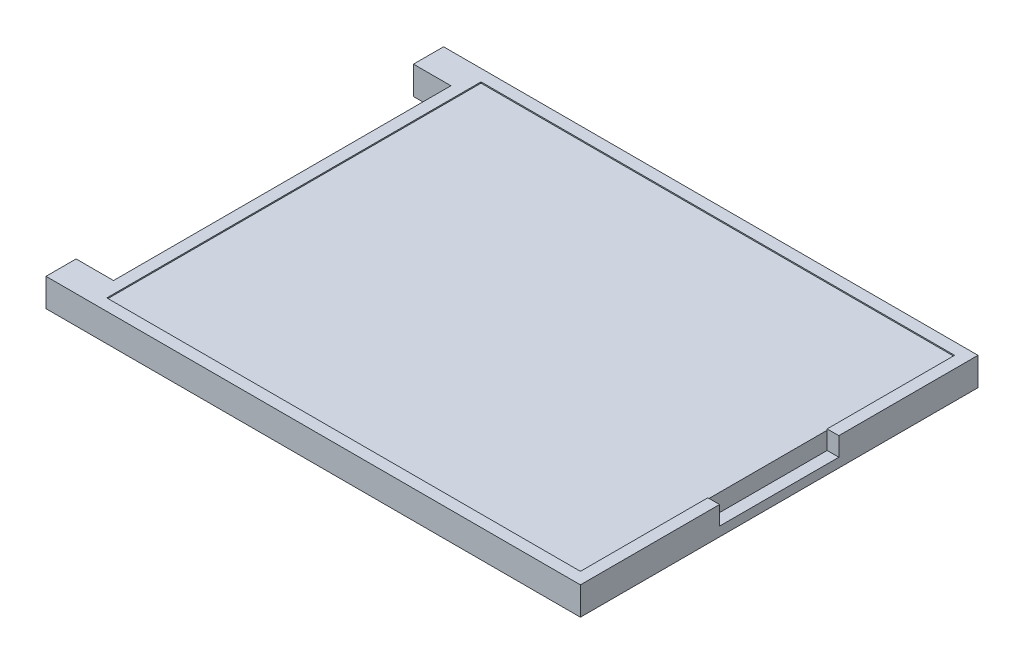
ISO-10303-21;
HEADER;
FILE_DESCRIPTION(('STEP AP214'),'2;1');
FILE_NAME('part.step','',(''),(''),'','','');
FILE_SCHEMA(('AUTOMOTIVE_DESIGN { 1 0 10303 214 1 1 1 1 }'));
ENDSEC;
DATA;
#1=APPLICATION_CONTEXT('core data for automotive mechanical design processes');
#2=APPLICATION_PROTOCOL_DEFINITION('international standard','automotive_design',2000,#1);
#3=PRODUCT_CONTEXT('',#1,'mechanical');
#4=PRODUCT('Part','Part','',(#3));
#5=PRODUCT_RELATED_PRODUCT_CATEGORY('part','',(#4));
#6=PRODUCT_DEFINITION_FORMATION('','',#4);
#7=PRODUCT_DEFINITION_CONTEXT('part definition',#1,'design');
#8=PRODUCT_DEFINITION('design','',#6,#7);
#9=PRODUCT_DEFINITION_SHAPE('','',#8);
#10=(LENGTH_UNIT() NAMED_UNIT(*) SI_UNIT(.MILLI.,.METRE.));
#11=(NAMED_UNIT(*) PLANE_ANGLE_UNIT() SI_UNIT($,.RADIAN.));
#12=(NAMED_UNIT(*) SI_UNIT($,.STERADIAN.) SOLID_ANGLE_UNIT());
#13=UNCERTAINTY_MEASURE_WITH_UNIT(LENGTH_MEASURE(1.E-05),#10,'distance_accuracy_value','');
#14=(GEOMETRIC_REPRESENTATION_CONTEXT(3) GLOBAL_UNCERTAINTY_ASSIGNED_CONTEXT((#13)) GLOBAL_UNIT_ASSIGNED_CONTEXT((#10,
#11,#12)) REPRESENTATION_CONTEXT('',''));
#15=CARTESIAN_POINT('',(0.,0.,0.));
#16=DIRECTION('',(0.,0.,1.));
#17=DIRECTION('',(1.,0.,0.));
#18=AXIS2_PLACEMENT_3D('',#15,#16,#17);
#19=CARTESIAN_POINT('',(0.,4.,0.));
#20=DIRECTION('',(0.,1.,0.));
#21=DIRECTION('',(0.,0.,1.));
#22=AXIS2_PLACEMENT_3D('',#19,#20,#21);
#23=PLANE('',#22);
#24=DIRECTION('',(0.,0.,-1.));
#25=VECTOR('',#24,1.);
#26=CARTESIAN_POINT('',(23.8,4.,-16.));
#27=LINE('',#26,#25);
#28=CARTESIAN_POINT('',(23.8,4.,-5.1));
#29=VERTEX_POINT('',#28);
#30=CARTESIAN_POINT('',(23.8,4.,-16.));
#31=VERTEX_POINT('',#30);
#32=EDGE_CURVE('E170',#29,#31,#27,.T.);
#33=ORIENTED_EDGE('',*,*,#32,.T.);
#34=DIRECTION('',(-1.,0.,0.));
#35=VECTOR('',#34,1.);
#36=CARTESIAN_POINT('',(-16.7,4.,-16.));
#37=LINE('',#36,#35);
#38=CARTESIAN_POINT('',(-16.7,4.,-16.));
#39=VERTEX_POINT('',#38);
#40=EDGE_CURVE('E162',#31,#39,#37,.T.);
#41=ORIENTED_EDGE('',*,*,#40,.T.);
#42=DIRECTION('',(0.,0.,1.));
#43=VECTOR('',#42,1.);
#44=CARTESIAN_POINT('',(-16.7,4.,-16.));
#45=LINE('',#44,#43);
#46=CARTESIAN_POINT('',(-16.7,4.,16.));
#47=VERTEX_POINT('',#46);
#48=EDGE_CURVE('E152',#39,#47,#45,.T.);
#49=ORIENTED_EDGE('',*,*,#48,.T.);
#50=DIRECTION('',(1.,0.,0.));
#51=VECTOR('',#50,1.);
#52=CARTESIAN_POINT('',(-16.7,4.,16.));
#53=LINE('',#52,#51);
#54=CARTESIAN_POINT('',(23.8,4.,16.));
#55=VERTEX_POINT('',#54);
#56=EDGE_CURVE('E134',#47,#55,#53,.T.);
#57=ORIENTED_EDGE('',*,*,#56,.T.);
#58=DIRECTION('',(0.,0.,-1.));
#59=VECTOR('',#58,1.);
#60=CARTESIAN_POINT('',(23.8,4.,-16.));
#61=LINE('',#60,#59);
#62=CARTESIAN_POINT('',(23.8,4.,5.1));
#63=VERTEX_POINT('',#62);
#64=EDGE_CURVE('E141',#55,#63,#61,.T.);
#65=ORIENTED_EDGE('',*,*,#64,.T.);
#66=DIRECTION('',(0.,0.,1.));
#67=VECTOR('',#66,1.);
#68=CARTESIAN_POINT('',(23.8,4.,-5.1));
#69=LINE('',#68,#67);
#70=EDGE_CURVE('E20',#63,#29,#69,.F.);
#71=ORIENTED_EDGE('',*,*,#70,.T.);
#72=EDGE_LOOP('',(#33,#41,#49,#57,#65,#71));
#73=FACE_BOUND('',#72,.T.);
#74=ADVANCED_FACE('F17',(#73),#23,.T.);
#75=CARTESIAN_POINT('',(23.8,2.5,-5.1));
#76=DIRECTION('',(-1.,0.,0.));
#77=DIRECTION('',(0.,0.,1.));
#78=AXIS2_PLACEMENT_3D('',#75,#76,#77);
#79=PLANE('',#78);
#80=DIRECTION('',(0.,1.,0.));
#81=VECTOR('',#80,1.);
#82=CARTESIAN_POINT('',(23.8,2.5,5.1));
#83=LINE('',#82,#81);
#84=CARTESIAN_POINT('',(23.8,2.5,5.1));
#85=VERTEX_POINT('',#84);
#86=EDGE_CURVE('E179',#63,#85,#83,.F.);
#87=ORIENTED_EDGE('',*,*,#86,.T.);
#88=DIRECTION('',(0.,0.,-1.));
#89=VECTOR('',#88,1.);
#90=CARTESIAN_POINT('',(23.8,2.5,0.));
#91=LINE('',#90,#89);
#92=CARTESIAN_POINT('',(23.8,2.5,-5.1));
#93=VERTEX_POINT('',#92);
#94=EDGE_CURVE('E184',#85,#93,#91,.T.);
#95=ORIENTED_EDGE('',*,*,#94,.T.);
#96=DIRECTION('',(0.,1.,0.));
#97=VECTOR('',#96,1.);
#98=CARTESIAN_POINT('',(23.8,2.5,-5.1));
#99=LINE('',#98,#97);
#100=EDGE_CURVE('E172',#93,#29,#99,.T.);
#101=ORIENTED_EDGE('',*,*,#100,.T.);
#102=ORIENTED_EDGE('',*,*,#70,.F.);
#103=EDGE_LOOP('',(#87,#95,#101,#102));
#104=FACE_BOUND('',#103,.T.);
#105=ADVANCED_FACE('F359',(#104),#79,.F.);
#106=CARTESIAN_POINT('',(23.8,4.,-16.));
#107=DIRECTION('',(1.,0.,0.));
#108=DIRECTION('',(0.,0.,-1.));
#109=AXIS2_PLACEMENT_3D('',#106,#107,#108);
#110=PLANE('',#109);
#111=DIRECTION('',(0.,1.,0.));
#112=VECTOR('',#111,1.);
#113=CARTESIAN_POINT('',(23.8,2.5,5.1));
#114=LINE('',#113,#112);
#115=CARTESIAN_POINT('',(23.8,4.1,5.1));
#116=VERTEX_POINT('',#115);
#117=EDGE_CURVE('E146',#116,#63,#114,.F.);
#118=ORIENTED_EDGE('',*,*,#117,.T.);
#119=ORIENTED_EDGE('',*,*,#64,.F.);
#120=DIRECTION('',(0.,1.,0.));
#121=VECTOR('',#120,1.);
#122=CARTESIAN_POINT('',(23.8,4.,16.));
#123=LINE('',#122,#121);
#124=CARTESIAN_POINT('',(23.8,4.1,16.));
#125=VERTEX_POINT('',#124);
#126=EDGE_CURVE('E144',#55,#125,#123,.T.);
#127=ORIENTED_EDGE('',*,*,#126,.T.);
#128=DIRECTION('',(0.,0.,1.));
#129=VECTOR('',#128,1.);
#130=CARTESIAN_POINT('',(23.8,4.1,0.));
#131=LINE('',#130,#129);
#132=EDGE_CURVE('E193',#116,#125,#131,.T.);
#133=ORIENTED_EDGE('',*,*,#132,.F.);
#134=EDGE_LOOP('',(#118,#119,#127,#133));
#135=FACE_BOUND('',#134,.T.);
#136=ADVANCED_FACE('F142',(#135),#110,.F.);
#137=CARTESIAN_POINT('',(-16.7,4.,16.));
#138=DIRECTION('',(0.,0.,1.));
#139=DIRECTION('',(1.,0.,0.));
#140=AXIS2_PLACEMENT_3D('',#137,#138,#139);
#141=PLANE('',#140);
#142=ORIENTED_EDGE('',*,*,#126,.F.);
#143=ORIENTED_EDGE('',*,*,#56,.F.);
#144=DIRECTION('',(0.,1.,0.));
#145=VECTOR('',#144,1.);
#146=CARTESIAN_POINT('',(-16.7,4.,16.));
#147=LINE('',#146,#145);
#148=CARTESIAN_POINT('',(-16.7,4.1,16.));
#149=VERTEX_POINT('',#148);
#150=EDGE_CURVE('E160',#47,#149,#147,.T.);
#151=ORIENTED_EDGE('',*,*,#150,.T.);
#152=DIRECTION('',(1.,0.,0.));
#153=VECTOR('',#152,1.);
#154=CARTESIAN_POINT('',(0.,4.1,16.));
#155=LINE('',#154,#153);
#156=EDGE_CURVE('E151',#125,#149,#155,.F.);
#157=ORIENTED_EDGE('',*,*,#156,.F.);
#158=EDGE_LOOP('',(#142,#143,#151,#157));
#159=FACE_BOUND('',#158,.T.);
#160=ADVANCED_FACE('F150',(#159),#141,.F.);
#161=CARTESIAN_POINT('',(-16.7,4.,-16.));
#162=DIRECTION('',(-1.,0.,0.));
#163=DIRECTION('',(0.,0.,1.));
#164=AXIS2_PLACEMENT_3D('',#161,#162,#163);
#165=PLANE('',#164);
#166=ORIENTED_EDGE('',*,*,#150,.F.);
#167=ORIENTED_EDGE('',*,*,#48,.F.);
#168=DIRECTION('',(0.,1.,0.));
#169=VECTOR('',#168,1.);
#170=CARTESIAN_POINT('',(-16.7,4.,-16.));
#171=LINE('',#170,#169);
#172=CARTESIAN_POINT('',(-16.7,4.1,-16.));
#173=VERTEX_POINT('',#172);
#174=EDGE_CURVE('E164',#39,#173,#171,.T.);
#175=ORIENTED_EDGE('',*,*,#174,.T.);
#176=DIRECTION('',(0.,0.,1.));
#177=VECTOR('',#176,1.);
#178=CARTESIAN_POINT('',(-16.7,4.1,0.));
#179=LINE('',#178,#177);
#180=EDGE_CURVE('E196',#149,#173,#179,.F.);
#181=ORIENTED_EDGE('',*,*,#180,.F.);
#182=EDGE_LOOP('',(#166,#167,#175,#181));
#183=FACE_BOUND('',#182,.T.);
#184=ADVANCED_FACE('F351',(#183),#165,.F.);
#185=CARTESIAN_POINT('',(-16.7,4.,-16.));
#186=DIRECTION('',(0.,0.,-1.));
#187=DIRECTION('',(-1.,0.,0.));
#188=AXIS2_PLACEMENT_3D('',#185,#186,#187);
#189=PLANE('',#188);
#190=ORIENTED_EDGE('',*,*,#174,.F.);
#191=ORIENTED_EDGE('',*,*,#40,.F.);
#192=DIRECTION('',(0.,1.,0.));
#193=VECTOR('',#192,1.);
#194=CARTESIAN_POINT('',(23.8,4.,-16.));
#195=LINE('',#194,#193);
#196=CARTESIAN_POINT('',(23.8,4.1,-16.));
#197=VERTEX_POINT('',#196);
#198=EDGE_CURVE('E167',#31,#197,#195,.T.);
#199=ORIENTED_EDGE('',*,*,#198,.T.);
#200=DIRECTION('',(1.,0.,0.));
#201=VECTOR('',#200,1.);
#202=CARTESIAN_POINT('',(0.,4.1,-16.));
#203=LINE('',#202,#201);
#204=EDGE_CURVE('E198',#173,#197,#203,.T.);
#205=ORIENTED_EDGE('',*,*,#204,.F.);
#206=EDGE_LOOP('',(#190,#191,#199,#205));
#207=FACE_BOUND('',#206,.T.);
#208=ADVANCED_FACE('F347',(#207),#189,.F.);
#209=CARTESIAN_POINT('',(23.8,4.,-16.));
#210=DIRECTION('',(1.,0.,0.));
#211=DIRECTION('',(0.,0.,-1.));
#212=AXIS2_PLACEMENT_3D('',#209,#210,#211);
#213=PLANE('',#212);
#214=DIRECTION('',(0.,1.,0.));
#215=VECTOR('',#214,1.);
#216=CARTESIAN_POINT('',(23.8,2.5,-5.1));
#217=LINE('',#216,#215);
#218=CARTESIAN_POINT('',(23.8,4.1,-5.1));
#219=VERTEX_POINT('',#218);
#220=EDGE_CURVE('E175',#29,#219,#217,.T.);
#221=ORIENTED_EDGE('',*,*,#220,.T.);
#222=DIRECTION('',(0.,0.,1.));
#223=VECTOR('',#222,1.);
#224=CARTESIAN_POINT('',(23.8,4.1,0.));
#225=LINE('',#224,#223);
#226=EDGE_CURVE('E200',#197,#219,#225,.T.);
#227=ORIENTED_EDGE('',*,*,#226,.F.);
#228=ORIENTED_EDGE('',*,*,#198,.F.);
#229=ORIENTED_EDGE('',*,*,#32,.F.);
#230=EDGE_LOOP('',(#221,#227,#228,#229));
#231=FACE_BOUND('',#230,.T.);
#232=ADVANCED_FACE('F343',(#231),#213,.F.);
#233=CARTESIAN_POINT('',(24.8,2.5,-5.1));
#234=DIRECTION('',(0.,0.,-1.));
#235=DIRECTION('',(-1.,0.,0.));
#236=AXIS2_PLACEMENT_3D('',#233,#234,#235);
#237=PLANE('',#236);
#238=ORIENTED_EDGE('',*,*,#220,.F.);
#239=ORIENTED_EDGE('',*,*,#100,.F.);
#240=DIRECTION('',(1.,0.,0.));
#241=VECTOR('',#240,1.);
#242=CARTESIAN_POINT('',(0.,2.5,-5.1));
#243=LINE('',#242,#241);
#244=CARTESIAN_POINT('',(24.8,2.5,-5.1));
#245=VERTEX_POINT('',#244);
#246=EDGE_CURVE('E187',#93,#245,#243,.T.);
#247=ORIENTED_EDGE('',*,*,#246,.T.);
#248=DIRECTION('',(0.,1.,0.));
#249=VECTOR('',#248,1.);
#250=CARTESIAN_POINT('',(24.8,4.1,-5.1));
#251=LINE('',#250,#249);
#252=CARTESIAN_POINT('',(24.8,4.1,-5.1));
#253=VERTEX_POINT('',#252);
#254=EDGE_CURVE('E221',#245,#253,#251,.T.);
#255=ORIENTED_EDGE('',*,*,#254,.T.);
#256=DIRECTION('',(1.,0.,0.));
#257=VECTOR('',#256,1.);
#258=CARTESIAN_POINT('',(0.,4.1,-5.1));
#259=LINE('',#258,#257);
#260=EDGE_CURVE('E202',#219,#253,#259,.T.);
#261=ORIENTED_EDGE('',*,*,#260,.F.);
#262=EDGE_LOOP('',(#238,#239,#247,#255,#261));
#263=FACE_BOUND('',#262,.T.);
#264=ADVANCED_FACE('F339',(#263),#237,.F.);
#265=CARTESIAN_POINT('',(24.8,2.5,5.1));
#266=DIRECTION('',(0.,0.,1.));
#267=DIRECTION('',(1.,0.,0.));
#268=AXIS2_PLACEMENT_3D('',#265,#266,#267);
#269=PLANE('',#268);
#270=DIRECTION('',(0.,1.,0.));
#271=VECTOR('',#270,1.);
#272=CARTESIAN_POINT('',(24.8,4.1,5.1));
#273=LINE('',#272,#271);
#274=CARTESIAN_POINT('',(24.8,4.1,5.1));
#275=VERTEX_POINT('',#274);
#276=CARTESIAN_POINT('',(24.8,2.5,5.1));
#277=VERTEX_POINT('',#276);
#278=EDGE_CURVE('E232',#275,#277,#273,.F.);
#279=ORIENTED_EDGE('',*,*,#278,.T.);
#280=DIRECTION('',(1.,0.,0.));
#281=VECTOR('',#280,1.);
#282=CARTESIAN_POINT('',(0.,2.5,5.1));
#283=LINE('',#282,#281);
#284=EDGE_CURVE('E181',#277,#85,#283,.F.);
#285=ORIENTED_EDGE('',*,*,#284,.T.);
#286=ORIENTED_EDGE('',*,*,#86,.F.);
#287=ORIENTED_EDGE('',*,*,#117,.F.);
#288=DIRECTION('',(1.,0.,0.));
#289=VECTOR('',#288,1.);
#290=CARTESIAN_POINT('',(0.,4.1,5.1));
#291=LINE('',#290,#289);
#292=EDGE_CURVE('E190',#275,#116,#291,.F.);
#293=ORIENTED_EDGE('',*,*,#292,.F.);
#294=EDGE_LOOP('',(#279,#285,#286,#287,#293));
#295=FACE_BOUND('',#294,.T.);
#296=ADVANCED_FACE('F335',(#295),#269,.F.);
#297=CARTESIAN_POINT('',(0.,2.5,0.));
#298=DIRECTION('',(0.,-1.,0.));
#299=DIRECTION('',(0.,0.,-1.));
#300=AXIS2_PLACEMENT_3D('',#297,#298,#299);
#301=PLANE('',#300);
#302=ORIENTED_EDGE('',*,*,#246,.F.);
#303=ORIENTED_EDGE('',*,*,#94,.F.);
#304=ORIENTED_EDGE('',*,*,#284,.F.);
#305=DIRECTION('',(0.,0.,1.));
#306=VECTOR('',#305,1.);
#307=CARTESIAN_POINT('',(24.8,2.5,0.));
#308=LINE('',#307,#306);
#309=EDGE_CURVE('E235',#277,#245,#308,.F.);
#310=ORIENTED_EDGE('',*,*,#309,.T.);
#311=EDGE_LOOP('',(#302,#303,#304,#310));
#312=FACE_BOUND('',#311,.T.);
#313=ADVANCED_FACE('F331',(#312),#301,.F.);
#314=CARTESIAN_POINT('',(0.,4.1,0.));
#315=DIRECTION('',(0.,1.,0.));
#316=DIRECTION('',(0.,0.,1.));
#317=AXIS2_PLACEMENT_3D('',#314,#315,#316);
#318=PLANE('',#317);
#319=DIRECTION('',(-1.,0.,0.));
#320=VECTOR('',#319,1.);
#321=CARTESIAN_POINT('',(0.,4.1,17.));
#322=LINE('',#321,#320);
#323=CARTESIAN_POINT('',(-20.9,4.1,17.));
#324=VERTEX_POINT('',#323);
#325=CARTESIAN_POINT('',(24.8,4.1,17.));
#326=VERTEX_POINT('',#325);
#327=EDGE_CURVE('E219',#324,#326,#322,.F.);
#328=ORIENTED_EDGE('',*,*,#327,.T.);
#329=DIRECTION('',(0.,0.,1.));
#330=VECTOR('',#329,1.);
#331=CARTESIAN_POINT('',(24.8,4.1,0.));
#332=LINE('',#331,#330);
#333=EDGE_CURVE('E229',#326,#275,#332,.F.);
#334=ORIENTED_EDGE('',*,*,#333,.T.);
#335=ORIENTED_EDGE('',*,*,#292,.T.);
#336=ORIENTED_EDGE('',*,*,#132,.T.);
#337=ORIENTED_EDGE('',*,*,#156,.T.);
#338=ORIENTED_EDGE('',*,*,#180,.T.);
#339=ORIENTED_EDGE('',*,*,#204,.T.);
#340=ORIENTED_EDGE('',*,*,#226,.T.);
#341=ORIENTED_EDGE('',*,*,#260,.T.);
#342=DIRECTION('',(0.,0.,1.));
#343=VECTOR('',#342,1.);
#344=CARTESIAN_POINT('',(24.8,4.1,0.));
#345=LINE('',#344,#343);
#346=CARTESIAN_POINT('',(24.8,4.1,-17.));
#347=VERTEX_POINT('',#346);
#348=EDGE_CURVE('E224',#253,#347,#345,.F.);
#349=ORIENTED_EDGE('',*,*,#348,.T.);
#350=DIRECTION('',(1.,0.,0.));
#351=VECTOR('',#350,1.);
#352=CARTESIAN_POINT('',(0.,4.1,-17.));
#353=LINE('',#352,#351);
#354=CARTESIAN_POINT('',(-20.9,4.1,-17.));
#355=VERTEX_POINT('',#354);
#356=EDGE_CURVE('E241',#347,#355,#353,.F.);
#357=ORIENTED_EDGE('',*,*,#356,.T.);
#358=DIRECTION('',(0.,0.,-1.));
#359=VECTOR('',#358,1.);
#360=CARTESIAN_POINT('',(-20.9,4.1,0.));
#361=LINE('',#360,#359);
#362=CARTESIAN_POINT('',(-20.9,4.1,-14.425));
#363=VERTEX_POINT('',#362);
#364=EDGE_CURVE('E246',#355,#363,#361,.F.);
#365=ORIENTED_EDGE('',*,*,#364,.T.);
#366=DIRECTION('',(-1.,0.,0.));
#367=VECTOR('',#366,1.);
#368=CARTESIAN_POINT('',(0.,4.1,-14.425));
#369=LINE('',#368,#367);
#370=CARTESIAN_POINT('',(-17.7,4.1,-14.425));
#371=VERTEX_POINT('',#370);
#372=EDGE_CURVE('E249',#363,#371,#369,.F.);
#373=ORIENTED_EDGE('',*,*,#372,.T.);
#374=DIRECTION('',(0.,0.,-1.));
#375=VECTOR('',#374,1.);
#376=CARTESIAN_POINT('',(-17.7,4.1,0.));
#377=LINE('',#376,#375);
#378=CARTESIAN_POINT('',(-17.7,4.1,14.425));
#379=VERTEX_POINT('',#378);
#380=EDGE_CURVE('E204',#371,#379,#377,.F.);
#381=ORIENTED_EDGE('',*,*,#380,.T.);
#382=DIRECTION('',(-1.,0.,0.));
#383=VECTOR('',#382,1.);
#384=CARTESIAN_POINT('',(0.,4.1,14.425));
#385=LINE('',#384,#383);
#386=CARTESIAN_POINT('',(-20.9,4.1,14.425));
#387=VERTEX_POINT('',#386);
#388=EDGE_CURVE('E207',#387,#379,#385,.F.);
#389=ORIENTED_EDGE('',*,*,#388,.F.);
#390=DIRECTION('',(0.,0.,-1.));
#391=VECTOR('',#390,1.);
#392=CARTESIAN_POINT('',(-20.9,4.1,0.));
#393=LINE('',#392,#391);
#394=EDGE_CURVE('E214',#387,#324,#393,.F.);
#395=ORIENTED_EDGE('',*,*,#394,.T.);
#396=EDGE_LOOP('',(#328,#334,#335,#336,#337,#338,#339,#340,#341,#349,#357,#365,#373,#381,#389,#395));
#397=FACE_BOUND('',#396,.T.);
#398=ADVANCED_FACE('F328',(#397),#318,.T.);
#399=CARTESIAN_POINT('',(-17.7,4.1,0.));
#400=DIRECTION('',(1.,0.,0.));
#401=DIRECTION('',(0.,0.,-1.));
#402=AXIS2_PLACEMENT_3D('',#399,#400,#401);
#403=PLANE('',#402);
#404=DIRECTION('',(0.,1.,0.));
#405=VECTOR('',#404,1.);
#406=CARTESIAN_POINT('',(-17.7,4.1,14.425));
#407=LINE('',#406,#405);
#408=CARTESIAN_POINT('',(-17.7,1.7,14.425));
#409=VERTEX_POINT('',#408);
#410=EDGE_CURVE('E209',#379,#409,#407,.F.);
#411=ORIENTED_EDGE('',*,*,#410,.F.);
#412=ORIENTED_EDGE('',*,*,#380,.F.);
#413=DIRECTION('',(0.,1.,0.));
#414=VECTOR('',#413,1.);
#415=CARTESIAN_POINT('',(-17.7,4.1,-14.425));
#416=LINE('',#415,#414);
#417=CARTESIAN_POINT('',(-17.7,1.7,-14.425));
#418=VERTEX_POINT('',#417);
#419=EDGE_CURVE('E252',#371,#418,#416,.F.);
#420=ORIENTED_EDGE('',*,*,#419,.T.);
#421=DIRECTION('',(0.,0.,1.));
#422=VECTOR('',#421,1.);
#423=CARTESIAN_POINT('',(-17.7,1.7,0.));
#424=LINE('',#423,#422);
#425=EDGE_CURVE('E255',#418,#409,#424,.T.);
#426=ORIENTED_EDGE('',*,*,#425,.T.);
#427=EDGE_LOOP('',(#411,#412,#420,#426));
#428=FACE_BOUND('',#427,.T.);
#429=ADVANCED_FACE('F303',(#428),#403,.F.);
#430=CARTESIAN_POINT('',(0.,4.1,14.425));
#431=DIRECTION('',(0.,0.,-1.));
#432=DIRECTION('',(-1.,0.,0.));
#433=AXIS2_PLACEMENT_3D('',#430,#431,#432);
#434=PLANE('',#433);
#435=ORIENTED_EDGE('',*,*,#388,.T.);
#436=ORIENTED_EDGE('',*,*,#410,.T.);
#437=DIRECTION('',(1.,0.,0.));
#438=VECTOR('',#437,1.);
#439=CARTESIAN_POINT('',(0.,1.7,14.425));
#440=LINE('',#439,#438);
#441=CARTESIAN_POINT('',(-20.9,1.7,14.425));
#442=VERTEX_POINT('',#441);
#443=EDGE_CURVE('E258',#409,#442,#440,.F.);
#444=ORIENTED_EDGE('',*,*,#443,.T.);
#445=DIRECTION('',(0.,1.,0.));
#446=VECTOR('',#445,1.);
#447=CARTESIAN_POINT('',(-20.9,4.1,14.425));
#448=LINE('',#447,#446);
#449=EDGE_CURVE('E211',#442,#387,#448,.T.);
#450=ORIENTED_EDGE('',*,*,#449,.T.);
#451=EDGE_LOOP('',(#435,#436,#444,#450));
#452=FACE_BOUND('',#451,.T.);
#453=ADVANCED_FACE('F300',(#452),#434,.T.);
#454=CARTESIAN_POINT('',(-20.9,4.1,0.));
#455=DIRECTION('',(1.,0.,0.));
#456=DIRECTION('',(0.,0.,-1.));
#457=AXIS2_PLACEMENT_3D('',#454,#455,#456);
#458=PLANE('',#457);
#459=DIRECTION('',(0.,1.,0.));
#460=VECTOR('',#459,1.);
#461=CARTESIAN_POINT('',(-20.9,4.1,17.));
#462=LINE('',#461,#460);
#463=CARTESIAN_POINT('',(-20.9,1.7,17.));
#464=VERTEX_POINT('',#463);
#465=EDGE_CURVE('E216',#464,#324,#462,.T.);
#466=ORIENTED_EDGE('',*,*,#465,.T.);
#467=ORIENTED_EDGE('',*,*,#394,.F.);
#468=ORIENTED_EDGE('',*,*,#449,.F.);
#469=DIRECTION('',(0.,0.,1.));
#470=VECTOR('',#469,1.);
#471=CARTESIAN_POINT('',(-20.9,1.7,0.));
#472=LINE('',#471,#470);
#473=EDGE_CURVE('E261',#442,#464,#472,.T.);
#474=ORIENTED_EDGE('',*,*,#473,.T.);
#475=EDGE_LOOP('',(#466,#467,#468,#474));
#476=FACE_BOUND('',#475,.T.);
#477=ADVANCED_FACE('F297',(#476),#458,.F.);
#478=CARTESIAN_POINT('',(0.,4.1,17.));
#479=DIRECTION('',(0.,0.,-1.));
#480=DIRECTION('',(-1.,0.,0.));
#481=AXIS2_PLACEMENT_3D('',#478,#479,#480);
#482=PLANE('',#481);
#483=DIRECTION('',(0.,1.,0.));
#484=VECTOR('',#483,1.);
#485=CARTESIAN_POINT('',(24.8,4.1,17.));
#486=LINE('',#485,#484);
#487=CARTESIAN_POINT('',(24.8,1.7,17.));
#488=VERTEX_POINT('',#487);
#489=EDGE_CURVE('E226',#488,#326,#486,.T.);
#490=ORIENTED_EDGE('',*,*,#489,.T.);
#491=ORIENTED_EDGE('',*,*,#327,.F.);
#492=ORIENTED_EDGE('',*,*,#465,.F.);
#493=DIRECTION('',(1.,0.,0.));
#494=VECTOR('',#493,1.);
#495=CARTESIAN_POINT('',(0.,1.7,17.));
#496=LINE('',#495,#494);
#497=EDGE_CURVE('E264',#464,#488,#496,.T.);
#498=ORIENTED_EDGE('',*,*,#497,.T.);
#499=EDGE_LOOP('',(#490,#491,#492,#498));
#500=FACE_BOUND('',#499,.T.);
#501=ADVANCED_FACE('F293',(#500),#482,.F.);
#502=CARTESIAN_POINT('',(24.8,4.1,0.));
#503=DIRECTION('',(-1.,0.,0.));
#504=DIRECTION('',(0.,0.,1.));
#505=AXIS2_PLACEMENT_3D('',#502,#503,#504);
#506=PLANE('',#505);
#507=ORIENTED_EDGE('',*,*,#278,.F.);
#508=ORIENTED_EDGE('',*,*,#333,.F.);
#509=ORIENTED_EDGE('',*,*,#489,.F.);
#510=DIRECTION('',(0.,0.,1.));
#511=VECTOR('',#510,1.);
#512=CARTESIAN_POINT('',(24.8,1.7,0.));
#513=LINE('',#512,#511);
#514=CARTESIAN_POINT('',(24.8,1.7,-17.));
#515=VERTEX_POINT('',#514);
#516=EDGE_CURVE('E267',#488,#515,#513,.F.);
#517=ORIENTED_EDGE('',*,*,#516,.T.);
#518=DIRECTION('',(0.,1.,0.));
#519=VECTOR('',#518,1.);
#520=CARTESIAN_POINT('',(24.8,4.1,-17.));
#521=LINE('',#520,#519);
#522=EDGE_CURVE('E238',#515,#347,#521,.T.);
#523=ORIENTED_EDGE('',*,*,#522,.T.);
#524=ORIENTED_EDGE('',*,*,#348,.F.);
#525=ORIENTED_EDGE('',*,*,#254,.F.);
#526=ORIENTED_EDGE('',*,*,#309,.F.);
#527=EDGE_LOOP('',(#507,#508,#509,#517,#523,#524,#525,#526));
#528=FACE_BOUND('',#527,.T.);
#529=ADVANCED_FACE('F288',(#528),#506,.F.);
#530=CARTESIAN_POINT('',(0.,4.1,-17.));
#531=DIRECTION('',(0.,0.,1.));
#532=DIRECTION('',(1.,0.,0.));
#533=AXIS2_PLACEMENT_3D('',#530,#531,#532);
#534=PLANE('',#533);
#535=DIRECTION('',(0.,1.,0.));
#536=VECTOR('',#535,1.);
#537=CARTESIAN_POINT('',(-20.9,4.1,-17.));
#538=LINE('',#537,#536);
#539=CARTESIAN_POINT('',(-20.9,1.7,-17.));
#540=VERTEX_POINT('',#539);
#541=EDGE_CURVE('E243',#540,#355,#538,.T.);
#542=ORIENTED_EDGE('',*,*,#541,.T.);
#543=ORIENTED_EDGE('',*,*,#356,.F.);
#544=ORIENTED_EDGE('',*,*,#522,.F.);
#545=DIRECTION('',(1.,0.,0.));
#546=VECTOR('',#545,1.);
#547=CARTESIAN_POINT('',(0.,1.7,-17.));
#548=LINE('',#547,#546);
#549=EDGE_CURVE('E270',#515,#540,#548,.F.);
#550=ORIENTED_EDGE('',*,*,#549,.T.);
#551=EDGE_LOOP('',(#542,#543,#544,#550));
#552=FACE_BOUND('',#551,.T.);
#553=ADVANCED_FACE('F283',(#552),#534,.F.);
#554=CARTESIAN_POINT('',(-20.9,4.1,0.));
#555=DIRECTION('',(1.,0.,0.));
#556=DIRECTION('',(0.,0.,-1.));
#557=AXIS2_PLACEMENT_3D('',#554,#555,#556);
#558=PLANE('',#557);
#559=DIRECTION('',(0.,1.,0.));
#560=VECTOR('',#559,1.);
#561=CARTESIAN_POINT('',(-20.9,4.1,-14.425));
#562=LINE('',#561,#560);
#563=CARTESIAN_POINT('',(-20.9,1.7,-14.425));
#564=VERTEX_POINT('',#563);
#565=EDGE_CURVE('E34',#564,#363,#562,.T.);
#566=ORIENTED_EDGE('',*,*,#565,.T.);
#567=ORIENTED_EDGE('',*,*,#364,.F.);
#568=ORIENTED_EDGE('',*,*,#541,.F.);
#569=DIRECTION('',(0.,0.,1.));
#570=VECTOR('',#569,1.);
#571=CARTESIAN_POINT('',(-20.9,1.7,0.));
#572=LINE('',#571,#570);
#573=EDGE_CURVE('E26',#540,#564,#572,.T.);
#574=ORIENTED_EDGE('',*,*,#573,.T.);
#575=EDGE_LOOP('',(#566,#567,#568,#574));
#576=FACE_BOUND('',#575,.T.);
#577=ADVANCED_FACE('F276',(#576),#558,.F.);
#578=CARTESIAN_POINT('',(0.,4.1,-14.425));
#579=DIRECTION('',(0.,0.,-1.));
#580=DIRECTION('',(-1.,0.,0.));
#581=AXIS2_PLACEMENT_3D('',#578,#579,#580);
#582=PLANE('',#581);
#583=ORIENTED_EDGE('',*,*,#419,.F.);
#584=ORIENTED_EDGE('',*,*,#372,.F.);
#585=ORIENTED_EDGE('',*,*,#565,.F.);
#586=DIRECTION('',(1.,0.,0.));
#587=VECTOR('',#586,1.);
#588=CARTESIAN_POINT('',(0.,1.7,-14.425));
#589=LINE('',#588,#587);
#590=EDGE_CURVE('E11',#564,#418,#589,.T.);
#591=ORIENTED_EDGE('',*,*,#590,.T.);
#592=EDGE_LOOP('',(#583,#584,#585,#591));
#593=FACE_BOUND('',#592,.T.);
#594=ADVANCED_FACE('F305',(#593),#582,.F.);
#595=CARTESIAN_POINT('',(0.,1.7,0.));
#596=DIRECTION('',(0.,1.,0.));
#597=DIRECTION('',(0.,0.,1.));
#598=AXIS2_PLACEMENT_3D('',#595,#596,#597);
#599=PLANE('',#598);
#600=ORIENTED_EDGE('',*,*,#573,.F.);
#601=ORIENTED_EDGE('',*,*,#549,.F.);
#602=ORIENTED_EDGE('',*,*,#516,.F.);
#603=ORIENTED_EDGE('',*,*,#497,.F.);
#604=ORIENTED_EDGE('',*,*,#473,.F.);
#605=ORIENTED_EDGE('',*,*,#443,.F.);
#606=ORIENTED_EDGE('',*,*,#425,.F.);
#607=ORIENTED_EDGE('',*,*,#590,.F.);
#608=EDGE_LOOP('',(#600,#601,#602,#603,#604,#605,#606,#607));
#609=FACE_BOUND('',#608,.T.);
#610=ADVANCED_FACE('F280',(#609),#599,.F.);
#611=CLOSED_SHELL('',(#74,#105,#136,#160,#184,#208,#232,#264,#296,#313,#398,#429,#453,#477,#501,
#529,#553,#577,#594,#610));
#612=MANIFOLD_SOLID_BREP('B1',#611);
#613=ADVANCED_BREP_SHAPE_REPRESENTATION('',(#18,#612),#14);
#614=SHAPE_DEFINITION_REPRESENTATION(#9,#613);
ENDSEC;
END-ISO-10303-21;
